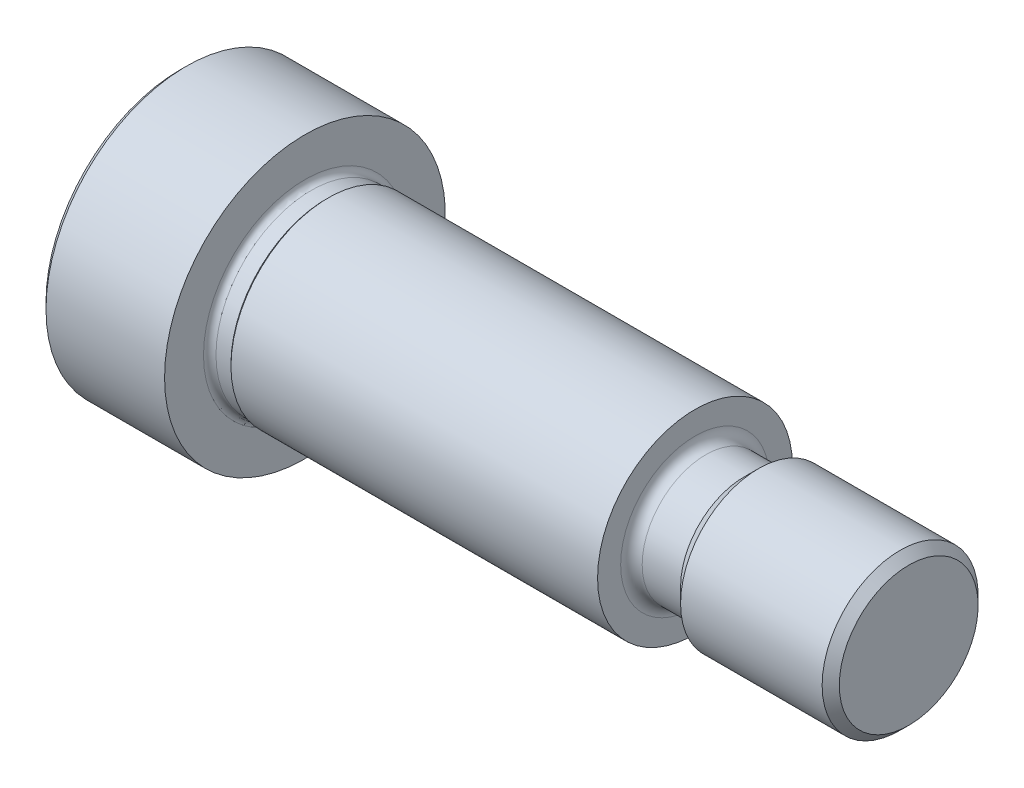
ISO-10303-21;
HEADER;
FILE_DESCRIPTION(('STEP AP214'),'2;1');
FILE_NAME('part.step','',(''),(''),'','','');
FILE_SCHEMA(('AUTOMOTIVE_DESIGN { 1 0 10303 214 1 1 1 1 }'));
ENDSEC;
DATA;
#1=APPLICATION_CONTEXT('core data for automotive mechanical design processes');
#2=APPLICATION_PROTOCOL_DEFINITION('international standard','automotive_design',2000,#1);
#3=PRODUCT_CONTEXT('',#1,'mechanical');
#4=PRODUCT('Part','Part','',(#3));
#5=PRODUCT_RELATED_PRODUCT_CATEGORY('part','',(#4));
#6=PRODUCT_DEFINITION_FORMATION('','',#4);
#7=PRODUCT_DEFINITION_CONTEXT('part definition',#1,'design');
#8=PRODUCT_DEFINITION('design','',#6,#7);
#9=PRODUCT_DEFINITION_SHAPE('','',#8);
#10=(LENGTH_UNIT() NAMED_UNIT(*) SI_UNIT(.MILLI.,.METRE.));
#11=(NAMED_UNIT(*) PLANE_ANGLE_UNIT() SI_UNIT($,.RADIAN.));
#12=(NAMED_UNIT(*) SI_UNIT($,.STERADIAN.) SOLID_ANGLE_UNIT());
#13=UNCERTAINTY_MEASURE_WITH_UNIT(LENGTH_MEASURE(1.E-05),#10,'distance_accuracy_value','');
#14=(GEOMETRIC_REPRESENTATION_CONTEXT(3) GLOBAL_UNCERTAINTY_ASSIGNED_CONTEXT((#13)) GLOBAL_UNIT_ASSIGNED_CONTEXT((#10,
#11,#12)) REPRESENTATION_CONTEXT('',''));
#15=CARTESIAN_POINT('',(0.,0.,0.));
#16=DIRECTION('',(0.,0.,1.));
#17=DIRECTION('',(1.,0.,0.));
#18=AXIS2_PLACEMENT_3D('',#15,#16,#17);
#19=CARTESIAN_POINT('',(0.,0.,0.));
#20=DIRECTION('',(-1.,0.,0.));
#21=DIRECTION('',(0.,0.,1.));
#22=AXIS2_PLACEMENT_3D('',#19,#20,#21);
#23=PLANE('',#22);
#24=CARTESIAN_POINT('',(0.,0.,0.));
#25=DIRECTION('',(-1.,0.,0.));
#26=DIRECTION('',(0.,0.,1.));
#27=AXIS2_PLACEMENT_3D('',#24,#25,#26);
#28=CIRCLE('',#27,17.2);
#29=CARTESIAN_POINT('',(0.,0.,17.2));
#30=VERTEX_POINT('',#29);
#31=EDGE_CURVE('E42',#30,#30,#28,.T.);
#32=ORIENTED_EDGE('',*,*,#31,.T.);
#33=EDGE_LOOP('',(#32));
#34=FACE_BOUND('',#33,.T.);
#35=DIRECTION('',(0.,-0.5,-0.866025403784439));
#36=VECTOR('',#35,1.);
#37=CARTESIAN_POINT('',(0.,-3.46410161513776,6.));
#38=LINE('',#37,#36);
#39=CARTESIAN_POINT('',(0.,-3.46410161513776,6.));
#40=VERTEX_POINT('',#39);
#41=CARTESIAN_POINT('',(0.,-6.92820323027552,0.));
#42=VERTEX_POINT('',#41);
#43=EDGE_CURVE('E49',#40,#42,#38,.T.);
#44=ORIENTED_EDGE('',*,*,#43,.T.);
#45=DIRECTION('',(0.,0.5,-0.866025403784438));
#46=VECTOR('',#45,1.);
#47=CARTESIAN_POINT('',(0.,-6.92820323027552,0.));
#48=LINE('',#47,#46);
#49=CARTESIAN_POINT('',(0.,-3.46410161513776,-6.));
#50=VERTEX_POINT('',#49);
#51=EDGE_CURVE('E324',#42,#50,#48,.T.);
#52=ORIENTED_EDGE('',*,*,#51,.T.);
#53=DIRECTION('',(0.,1.,0.));
#54=VECTOR('',#53,1.);
#55=CARTESIAN_POINT('',(0.,-3.46410161513776,-6.));
#56=LINE('',#55,#54);
#57=CARTESIAN_POINT('',(0.,3.46410161513775,-6.));
#58=VERTEX_POINT('',#57);
#59=EDGE_CURVE('E129',#50,#58,#56,.T.);
#60=ORIENTED_EDGE('',*,*,#59,.T.);
#61=DIRECTION('',(0.,0.500000000000001,0.866025403784438));
#62=VECTOR('',#61,1.);
#63=CARTESIAN_POINT('',(0.,3.46410161513775,-6.));
#64=LINE('',#63,#62);
#65=CARTESIAN_POINT('',(0.,6.92820323027551,0.));
#66=VERTEX_POINT('',#65);
#67=EDGE_CURVE('E327',#58,#66,#64,.T.);
#68=ORIENTED_EDGE('',*,*,#67,.T.);
#69=DIRECTION('',(0.,-0.500000000000001,0.866025403784438));
#70=VECTOR('',#69,1.);
#71=CARTESIAN_POINT('',(0.,6.92820323027551,0.));
#72=LINE('',#71,#70);
#73=CARTESIAN_POINT('',(0.,3.46410161513775,6.));
#74=VERTEX_POINT('',#73);
#75=EDGE_CURVE('E329',#66,#74,#72,.T.);
#76=ORIENTED_EDGE('',*,*,#75,.T.);
#77=DIRECTION('',(0.,-1.,0.));
#78=VECTOR('',#77,1.);
#79=CARTESIAN_POINT('',(0.,3.46410161513775,6.));
#80=LINE('',#79,#78);
#81=EDGE_CURVE('E331',#74,#40,#80,.T.);
#82=ORIENTED_EDGE('',*,*,#81,.T.);
#83=EDGE_LOOP('',(#44,#52,#60,#68,#76,#82));
#84=FACE_BOUND('',#83,.T.);
#85=ADVANCED_FACE('F34',(#34,#84),#23,.T.);
#86=CARTESIAN_POINT('',(-6.34999999999999,0.,0.));
#87=DIRECTION('',(-1.,0.,0.));
#88=DIRECTION('',(0.,0.,1.));
#89=AXIS2_PLACEMENT_3D('',#86,#87,#88);
#90=CYLINDRICAL_SURFACE('',#89,18.);
#91=CARTESIAN_POINT('',(0.800000000000006,0.,0.));
#92=DIRECTION('',(-1.,0.,0.));
#93=DIRECTION('',(0.,0.,1.));
#94=AXIS2_PLACEMENT_3D('',#91,#92,#93);
#95=CIRCLE('',#94,18.);
#96=CARTESIAN_POINT('',(0.800000000000006,0.,18.));
#97=VERTEX_POINT('',#96);
#98=EDGE_CURVE('E11',#97,#97,#95,.F.);
#99=ORIENTED_EDGE('',*,*,#98,.T.);
#100=EDGE_LOOP('',(#99));
#101=FACE_BOUND('',#100,.T.);
#102=CARTESIAN_POINT('',(16.,0.,0.));
#103=DIRECTION('',(-1.,0.,0.));
#104=DIRECTION('',(0.,0.,1.));
#105=AXIS2_PLACEMENT_3D('',#102,#103,#104);
#106=CIRCLE('',#105,18.);
#107=CARTESIAN_POINT('',(16.,0.,18.));
#108=VERTEX_POINT('',#107);
#109=EDGE_CURVE('E176',#108,#108,#106,.T.);
#110=ORIENTED_EDGE('',*,*,#109,.T.);
#111=EDGE_LOOP('',(#110));
#112=FACE_BOUND('',#111,.T.);
#113=ADVANCED_FACE('F195',(#101,#112),#90,.T.);
#114=CARTESIAN_POINT('',(16.,18.,0.));
#115=DIRECTION('',(1.,0.,0.));
#116=DIRECTION('',(0.,0.,-1.));
#117=AXIS2_PLACEMENT_3D('',#114,#115,#116);
#118=PLANE('',#117);
#119=CARTESIAN_POINT('',(16.,0.,0.));
#120=DIRECTION('',(-1.,0.,0.));
#121=DIRECTION('',(0.,0.,1.));
#122=AXIS2_PLACEMENT_3D('',#119,#120,#121);
#123=CIRCLE('',#122,13.01);
#124=CARTESIAN_POINT('',(16.,0.,13.01));
#125=VERTEX_POINT('',#124);
#126=EDGE_CURVE('E173',#125,#125,#123,.T.);
#127=ORIENTED_EDGE('',*,*,#126,.T.);
#128=EDGE_LOOP('',(#127));
#129=FACE_BOUND('',#128,.T.);
#130=ORIENTED_EDGE('',*,*,#109,.F.);
#131=EDGE_LOOP('',(#130));
#132=FACE_BOUND('',#131,.T.);
#133=ADVANCED_FACE('F199',(#129,#132),#118,.T.);
#134=CARTESIAN_POINT('',(16.8,0.,0.));
#135=DIRECTION('',(-1.,0.,0.));
#136=DIRECTION('',(0.,0.,1.));
#137=AXIS2_PLACEMENT_3D('',#134,#135,#136);
#138=TOROIDAL_SURFACE('',#137,13.01,0.800000000000002);
#139=ORIENTED_EDGE('',*,*,#126,.F.);
#140=EDGE_LOOP('',(#139));
#141=FACE_BOUND('',#140,.T.);
#142=CARTESIAN_POINT('',(16.8,0.,0.));
#143=DIRECTION('',(-1.,0.,0.));
#144=DIRECTION('',(0.,0.,1.));
#145=AXIS2_PLACEMENT_3D('',#142,#143,#144);
#146=CIRCLE('',#145,12.21);
#147=CARTESIAN_POINT('',(16.8,0.,12.21));
#148=VERTEX_POINT('',#147);
#149=EDGE_CURVE('E170',#148,#148,#146,.T.);
#150=ORIENTED_EDGE('',*,*,#149,.T.);
#151=EDGE_LOOP('',(#150));
#152=FACE_BOUND('',#151,.T.);
#153=ADVANCED_FACE('F205',(#141,#152),#138,.F.);
#154=CARTESIAN_POINT('',(-6.34999999999999,0.,0.));
#155=DIRECTION('',(-1.,0.,0.));
#156=DIRECTION('',(0.,0.,1.));
#157=AXIS2_PLACEMENT_3D('',#154,#155,#156);
#158=CYLINDRICAL_SURFACE('',#157,12.21);
#159=CARTESIAN_POINT('',(18.72,0.,0.));
#160=DIRECTION('',(-1.,0.,0.));
#161=DIRECTION('',(0.,0.,1.));
#162=AXIS2_PLACEMENT_3D('',#159,#160,#161);
#163=CIRCLE('',#162,12.21);
#164=CARTESIAN_POINT('',(18.72,0.,12.21));
#165=VERTEX_POINT('',#164);
#166=EDGE_CURVE('E167',#165,#165,#163,.T.);
#167=ORIENTED_EDGE('',*,*,#166,.T.);
#168=EDGE_LOOP('',(#167));
#169=FACE_BOUND('',#168,.T.);
#170=ORIENTED_EDGE('',*,*,#149,.F.);
#171=EDGE_LOOP('',(#170));
#172=FACE_BOUND('',#171,.T.);
#173=ADVANCED_FACE('F209',(#169,#172),#158,.T.);
#174=CARTESIAN_POINT('',(18.72,0.,0.));
#175=DIRECTION('',(1.,0.,0.));
#176=DIRECTION('',(0.,0.,-1.));
#177=AXIS2_PLACEMENT_3D('',#174,#175,#176);
#178=CONICAL_SURFACE('',#177,12.21,0.785398163397448);
#179=CARTESIAN_POINT('',(19.,0.,0.));
#180=DIRECTION('',(-1.,0.,0.));
#181=DIRECTION('',(0.,0.,1.));
#182=AXIS2_PLACEMENT_3D('',#179,#180,#181);
#183=CIRCLE('',#182,12.49);
#184=CARTESIAN_POINT('',(19.,0.,12.49));
#185=VERTEX_POINT('',#184);
#186=EDGE_CURVE('E164',#185,#185,#183,.T.);
#187=ORIENTED_EDGE('',*,*,#186,.T.);
#188=EDGE_LOOP('',(#187));
#189=FACE_BOUND('',#188,.T.);
#190=ORIENTED_EDGE('',*,*,#166,.F.);
#191=EDGE_LOOP('',(#190));
#192=FACE_BOUND('',#191,.T.);
#193=ADVANCED_FACE('F213',(#189,#192),#178,.T.);
#194=CARTESIAN_POINT('',(-6.34999999999999,0.,0.));
#195=DIRECTION('',(-1.,0.,0.));
#196=DIRECTION('',(0.,0.,1.));
#197=AXIS2_PLACEMENT_3D('',#194,#195,#196);
#198=CYLINDRICAL_SURFACE('',#197,12.49);
#199=CARTESIAN_POINT('',(66.,0.,0.));
#200=DIRECTION('',(-1.,0.,0.));
#201=DIRECTION('',(0.,0.,1.));
#202=AXIS2_PLACEMENT_3D('',#199,#200,#201);
#203=CIRCLE('',#202,12.49);
#204=CARTESIAN_POINT('',(66.,0.,12.49));
#205=VERTEX_POINT('',#204);
#206=EDGE_CURVE('E161',#205,#205,#203,.T.);
#207=ORIENTED_EDGE('',*,*,#206,.T.);
#208=EDGE_LOOP('',(#207));
#209=FACE_BOUND('',#208,.T.);
#210=ORIENTED_EDGE('',*,*,#186,.F.);
#211=EDGE_LOOP('',(#210));
#212=FACE_BOUND('',#211,.T.);
#213=ADVANCED_FACE('F217',(#209,#212),#198,.T.);
#214=CARTESIAN_POINT('',(66.,12.49,0.));
#215=DIRECTION('',(1.,0.,0.));
#216=DIRECTION('',(0.,0.,-1.));
#217=AXIS2_PLACEMENT_3D('',#214,#215,#216);
#218=PLANE('',#217);
#219=CARTESIAN_POINT('',(66.,0.,0.));
#220=DIRECTION('',(-1.,0.,0.));
#221=DIRECTION('',(0.,0.,1.));
#222=AXIS2_PLACEMENT_3D('',#219,#220,#221);
#223=CIRCLE('',#222,9.53);
#224=CARTESIAN_POINT('',(66.,0.,9.53));
#225=VERTEX_POINT('',#224);
#226=EDGE_CURVE('E158',#225,#225,#223,.T.);
#227=ORIENTED_EDGE('',*,*,#226,.T.);
#228=EDGE_LOOP('',(#227));
#229=FACE_BOUND('',#228,.T.);
#230=ORIENTED_EDGE('',*,*,#206,.F.);
#231=EDGE_LOOP('',(#230));
#232=FACE_BOUND('',#231,.T.);
#233=ADVANCED_FACE('F221',(#229,#232),#218,.T.);
#234=CARTESIAN_POINT('',(67.38,0.,0.));
#235=DIRECTION('',(-1.,0.,0.));
#236=DIRECTION('',(0.,0.,1.));
#237=AXIS2_PLACEMENT_3D('',#234,#235,#236);
#238=TOROIDAL_SURFACE('',#237,9.53,1.37999999999999);
#239=CARTESIAN_POINT('',(67.38,0.,0.));
#240=DIRECTION('',(-1.,0.,0.));
#241=DIRECTION('',(0.,0.,1.));
#242=AXIS2_PLACEMENT_3D('',#239,#240,#241);
#243=CIRCLE('',#242,8.15000000000001);
#244=CARTESIAN_POINT('',(67.38,0.,8.15000000000001));
#245=VERTEX_POINT('',#244);
#246=EDGE_CURVE('E155',#245,#245,#243,.T.);
#247=ORIENTED_EDGE('',*,*,#246,.T.);
#248=EDGE_LOOP('',(#247));
#249=FACE_BOUND('',#248,.T.);
#250=ORIENTED_EDGE('',*,*,#226,.F.);
#251=EDGE_LOOP('',(#250));
#252=FACE_BOUND('',#251,.T.);
#253=ADVANCED_FACE('F225',(#249,#252),#238,.F.);
#254=CARTESIAN_POINT('',(-6.34999999999999,0.,0.));
#255=DIRECTION('',(-1.,0.,0.));
#256=DIRECTION('',(0.,0.,1.));
#257=AXIS2_PLACEMENT_3D('',#254,#255,#256);
#258=CYLINDRICAL_SURFACE('',#257,8.15000000000001);
#259=CARTESIAN_POINT('',(72.3,0.,0.));
#260=DIRECTION('',(-1.,0.,0.));
#261=DIRECTION('',(0.,0.,1.));
#262=AXIS2_PLACEMENT_3D('',#259,#260,#261);
#263=CIRCLE('',#262,8.15);
#264=CARTESIAN_POINT('',(72.3,0.,8.15));
#265=VERTEX_POINT('',#264);
#266=EDGE_CURVE('E152',#265,#265,#263,.T.);
#267=ORIENTED_EDGE('',*,*,#266,.T.);
#268=EDGE_LOOP('',(#267));
#269=FACE_BOUND('',#268,.T.);
#270=ORIENTED_EDGE('',*,*,#246,.F.);
#271=EDGE_LOOP('',(#270));
#272=FACE_BOUND('',#271,.T.);
#273=ADVANCED_FACE('F229',(#269,#272),#258,.T.);
#274=CARTESIAN_POINT('',(72.3,0.,0.));
#275=DIRECTION('',(1.,0.,0.));
#276=DIRECTION('',(0.,0.,-1.));
#277=AXIS2_PLACEMENT_3D('',#274,#275,#276);
#278=CONICAL_SURFACE('',#277,8.15,0.785398163397447);
#279=CARTESIAN_POINT('',(74.15,0.,0.));
#280=DIRECTION('',(-1.,0.,0.));
#281=DIRECTION('',(0.,0.,1.));
#282=AXIS2_PLACEMENT_3D('',#279,#280,#281);
#283=CIRCLE('',#282,10.);
#284=CARTESIAN_POINT('',(74.15,0.,10.));
#285=VERTEX_POINT('',#284);
#286=EDGE_CURVE('E149',#285,#285,#283,.T.);
#287=ORIENTED_EDGE('',*,*,#286,.T.);
#288=EDGE_LOOP('',(#287));
#289=FACE_BOUND('',#288,.T.);
#290=ORIENTED_EDGE('',*,*,#266,.F.);
#291=EDGE_LOOP('',(#290));
#292=FACE_BOUND('',#291,.T.);
#293=ADVANCED_FACE('F233',(#289,#292),#278,.T.);
#294=CARTESIAN_POINT('',(-6.34999999999999,0.,0.));
#295=DIRECTION('',(-1.,0.,0.));
#296=DIRECTION('',(0.,0.,1.));
#297=AXIS2_PLACEMENT_3D('',#294,#295,#296);
#298=CYLINDRICAL_SURFACE('',#297,10.);
#299=CARTESIAN_POINT('',(92.2984999999999,0.,0.));
#300=DIRECTION('',(-1.,0.,0.));
#301=DIRECTION('',(0.,0.,1.));
#302=AXIS2_PLACEMENT_3D('',#299,#300,#301);
#303=CIRCLE('',#302,10.);
#304=CARTESIAN_POINT('',(92.2984999999999,0.,10.));
#305=VERTEX_POINT('',#304);
#306=EDGE_CURVE('E146',#305,#305,#303,.T.);
#307=ORIENTED_EDGE('',*,*,#306,.T.);
#308=EDGE_LOOP('',(#307));
#309=FACE_BOUND('',#308,.T.);
#310=ORIENTED_EDGE('',*,*,#286,.F.);
#311=EDGE_LOOP('',(#310));
#312=FACE_BOUND('',#311,.T.);
#313=ADVANCED_FACE('F237',(#309,#312),#298,.T.);
#314=CARTESIAN_POINT('',(92.2984999999999,0.,0.));
#315=DIRECTION('',(-1.,0.,0.));
#316=DIRECTION('',(0.,0.,1.));
#317=AXIS2_PLACEMENT_3D('',#314,#315,#316);
#318=CONICAL_SURFACE('',#317,10.,0.785398163397427);
#319=CARTESIAN_POINT('',(93.4,0.,0.));
#320=DIRECTION('',(-1.,0.,0.));
#321=DIRECTION('',(0.,0.,1.));
#322=AXIS2_PLACEMENT_3D('',#319,#320,#321);
#323=CIRCLE('',#322,8.8985);
#324=CARTESIAN_POINT('',(93.4,0.,8.8985));
#325=VERTEX_POINT('',#324);
#326=EDGE_CURVE('E142',#325,#325,#323,.T.);
#327=ORIENTED_EDGE('',*,*,#326,.T.);
#328=EDGE_LOOP('',(#327));
#329=FACE_BOUND('',#328,.T.);
#330=ORIENTED_EDGE('',*,*,#306,.F.);
#331=EDGE_LOOP('',(#330));
#332=FACE_BOUND('',#331,.T.);
#333=ADVANCED_FACE('F190',(#329,#332),#318,.T.);
#334=CARTESIAN_POINT('',(93.4,8.8985,0.));
#335=DIRECTION('',(1.,0.,0.));
#336=DIRECTION('',(0.,0.,-1.));
#337=AXIS2_PLACEMENT_3D('',#334,#335,#336);
#338=PLANE('',#337);
#339=ORIENTED_EDGE('',*,*,#326,.F.);
#340=EDGE_LOOP('',(#339));
#341=FACE_BOUND('',#340,.T.);
#342=ADVANCED_FACE('F183',(#341),#338,.T.);
#343=CARTESIAN_POINT('',(0.,0.,0.));
#344=DIRECTION('',(1.,0.,0.));
#345=DIRECTION('',(0.,0.,-1.));
#346=AXIS2_PLACEMENT_3D('',#343,#344,#345);
#347=CONICAL_SURFACE('',#346,17.2,0.785398163397444);
#348=ORIENTED_EDGE('',*,*,#98,.F.);
#349=EDGE_LOOP('',(#348));
#350=FACE_BOUND('',#349,.T.);
#351=ORIENTED_EDGE('',*,*,#31,.F.);
#352=EDGE_LOOP('',(#351));
#353=FACE_BOUND('',#352,.T.);
#354=ADVANCED_FACE('F36',(#350,#353),#347,.T.);
#355=CARTESIAN_POINT('',(10.,-6.92820323027552,0.));
#356=DIRECTION('',(0.,0.866025403784439,0.5));
#357=DIRECTION('',(0.,-0.5,0.866025403784439));
#358=AXIS2_PLACEMENT_3D('',#355,#356,#357);
#359=PLANE('',#358);
#360=DIRECTION('',(0.,0.5,-0.866025403784438));
#361=VECTOR('',#360,1.);
#362=CARTESIAN_POINT('',(10.,-6.92820323027552,0.));
#363=LINE('',#362,#361);
#364=CARTESIAN_POINT('',(10.,-6.92820323027552,0.));
#365=VERTEX_POINT('',#364);
#366=CARTESIAN_POINT('',(10.,-5.19615242270663,-3.));
#367=VERTEX_POINT('',#366);
#368=EDGE_CURVE('E57',#365,#367,#363,.T.);
#369=ORIENTED_EDGE('',*,*,#368,.T.);
#370=CARTESIAN_POINT('',(10.,-3.46410161513776,-6.));
#371=VERTEX_POINT('',#370);
#372=EDGE_CURVE('E107',#367,#371,#363,.T.);
#373=ORIENTED_EDGE('',*,*,#372,.T.);
#374=DIRECTION('',(-1.,0.,0.));
#375=VECTOR('',#374,1.);
#376=CARTESIAN_POINT('',(10.,-3.46410161513776,-6.));
#377=LINE('',#376,#375);
#378=EDGE_CURVE('E111',#371,#50,#377,.T.);
#379=ORIENTED_EDGE('',*,*,#378,.T.);
#380=ORIENTED_EDGE('',*,*,#51,.F.);
#381=DIRECTION('',(-1.,0.,0.));
#382=VECTOR('',#381,1.);
#383=CARTESIAN_POINT('',(10.,-6.92820323027552,0.));
#384=LINE('',#383,#382);
#385=EDGE_CURVE('E323',#365,#42,#384,.T.);
#386=ORIENTED_EDGE('',*,*,#385,.F.);
#387=EDGE_LOOP('',(#369,#373,#379,#380,#386));
#388=FACE_BOUND('',#387,.T.);
#389=ADVANCED_FACE('F109',(#388),#359,.T.);
#390=CARTESIAN_POINT('',(10.,-3.46410161513776,-6.));
#391=DIRECTION('',(0.,0.,1.));
#392=DIRECTION('',(0.,-1.,0.));
#393=AXIS2_PLACEMENT_3D('',#390,#391,#392);
#394=PLANE('',#393);
#395=DIRECTION('',(0.,1.,0.));
#396=VECTOR('',#395,1.);
#397=CARTESIAN_POINT('',(10.,-3.46410161513776,-6.));
#398=LINE('',#397,#396);
#399=CARTESIAN_POINT('',(10.,0.,-6.));
#400=VERTEX_POINT('',#399);
#401=EDGE_CURVE('E116',#371,#400,#398,.T.);
#402=ORIENTED_EDGE('',*,*,#401,.T.);
#403=CARTESIAN_POINT('',(10.,3.46410161513775,-6.));
#404=VERTEX_POINT('',#403);
#405=EDGE_CURVE('E124',#400,#404,#398,.T.);
#406=ORIENTED_EDGE('',*,*,#405,.T.);
#407=DIRECTION('',(-1.,0.,0.));
#408=VECTOR('',#407,1.);
#409=CARTESIAN_POINT('',(10.,3.46410161513775,-6.));
#410=LINE('',#409,#408);
#411=EDGE_CURVE('E131',#404,#58,#410,.T.);
#412=ORIENTED_EDGE('',*,*,#411,.T.);
#413=ORIENTED_EDGE('',*,*,#59,.F.);
#414=ORIENTED_EDGE('',*,*,#378,.F.);
#415=EDGE_LOOP('',(#402,#406,#412,#413,#414));
#416=FACE_BOUND('',#415,.T.);
#417=ADVANCED_FACE('F127',(#416),#394,.T.);
#418=CARTESIAN_POINT('',(10.,3.46410161513775,-6.));
#419=DIRECTION('',(0.,-0.866025403784438,0.500000000000001));
#420=DIRECTION('',(0.,-0.500000000000001,-0.866025403784438));
#421=AXIS2_PLACEMENT_3D('',#418,#419,#420);
#422=PLANE('',#421);
#423=DIRECTION('',(0.,0.500000000000001,0.866025403784438));
#424=VECTOR('',#423,1.);
#425=CARTESIAN_POINT('',(10.,3.46410161513775,-6.));
#426=LINE('',#425,#424);
#427=CARTESIAN_POINT('',(10.,5.19615242270663,-3.00000000000001));
#428=VERTEX_POINT('',#427);
#429=EDGE_CURVE('E287',#404,#428,#426,.T.);
#430=ORIENTED_EDGE('',*,*,#429,.T.);
#431=CARTESIAN_POINT('',(10.,6.92820323027551,0.));
#432=VERTEX_POINT('',#431);
#433=EDGE_CURVE('E123',#428,#432,#426,.T.);
#434=ORIENTED_EDGE('',*,*,#433,.T.);
#435=DIRECTION('',(-1.,0.,0.));
#436=VECTOR('',#435,1.);
#437=CARTESIAN_POINT('',(10.,6.92820323027551,0.));
#438=LINE('',#437,#436);
#439=EDGE_CURVE('E137',#432,#66,#438,.T.);
#440=ORIENTED_EDGE('',*,*,#439,.T.);
#441=ORIENTED_EDGE('',*,*,#67,.F.);
#442=ORIENTED_EDGE('',*,*,#411,.F.);
#443=EDGE_LOOP('',(#430,#434,#440,#441,#442));
#444=FACE_BOUND('',#443,.T.);
#445=ADVANCED_FACE('F251',(#444),#422,.T.);
#446=CARTESIAN_POINT('',(10.,6.92820323027551,0.));
#447=DIRECTION('',(0.,-0.866025403784438,-0.500000000000001));
#448=DIRECTION('',(0.,0.500000000000001,-0.866025403784438));
#449=AXIS2_PLACEMENT_3D('',#446,#447,#448);
#450=PLANE('',#449);
#451=DIRECTION('',(0.,-0.500000000000001,0.866025403784438));
#452=VECTOR('',#451,1.);
#453=CARTESIAN_POINT('',(10.,6.92820323027551,0.));
#454=LINE('',#453,#452);
#455=CARTESIAN_POINT('',(10.,5.19615242270663,3.00000000000001));
#456=VERTEX_POINT('',#455);
#457=EDGE_CURVE('E292',#432,#456,#454,.T.);
#458=ORIENTED_EDGE('',*,*,#457,.T.);
#459=CARTESIAN_POINT('',(10.,3.46410161513775,6.));
#460=VERTEX_POINT('',#459);
#461=EDGE_CURVE('E298',#456,#460,#454,.T.);
#462=ORIENTED_EDGE('',*,*,#461,.T.);
#463=DIRECTION('',(-1.,0.,0.));
#464=VECTOR('',#463,1.);
#465=CARTESIAN_POINT('',(10.,3.46410161513775,6.));
#466=LINE('',#465,#464);
#467=EDGE_CURVE('E318',#460,#74,#466,.T.);
#468=ORIENTED_EDGE('',*,*,#467,.T.);
#469=ORIENTED_EDGE('',*,*,#75,.F.);
#470=ORIENTED_EDGE('',*,*,#439,.F.);
#471=EDGE_LOOP('',(#458,#462,#468,#469,#470));
#472=FACE_BOUND('',#471,.T.);
#473=ADVANCED_FACE('F254',(#472),#450,.T.);
#474=CARTESIAN_POINT('',(10.,3.46410161513775,6.));
#475=DIRECTION('',(0.,0.,-1.));
#476=DIRECTION('',(-1.,0.,0.));
#477=AXIS2_PLACEMENT_3D('',#474,#475,#476);
#478=PLANE('',#477);
#479=DIRECTION('',(0.,-1.,0.));
#480=VECTOR('',#479,1.);
#481=CARTESIAN_POINT('',(10.,3.46410161513775,6.));
#482=LINE('',#481,#480);
#483=CARTESIAN_POINT('',(10.,0.,6.));
#484=VERTEX_POINT('',#483);
#485=EDGE_CURVE('E305',#460,#484,#482,.T.);
#486=ORIENTED_EDGE('',*,*,#485,.T.);
#487=CARTESIAN_POINT('',(10.,-3.46410161513776,6.));
#488=VERTEX_POINT('',#487);
#489=EDGE_CURVE('E308',#484,#488,#482,.T.);
#490=ORIENTED_EDGE('',*,*,#489,.T.);
#491=DIRECTION('',(-1.,0.,0.));
#492=VECTOR('',#491,1.);
#493=CARTESIAN_POINT('',(10.,-3.46410161513776,6.));
#494=LINE('',#493,#492);
#495=EDGE_CURVE('E336',#488,#40,#494,.T.);
#496=ORIENTED_EDGE('',*,*,#495,.T.);
#497=ORIENTED_EDGE('',*,*,#81,.F.);
#498=ORIENTED_EDGE('',*,*,#467,.F.);
#499=EDGE_LOOP('',(#486,#490,#496,#497,#498));
#500=FACE_BOUND('',#499,.T.);
#501=ADVANCED_FACE('F258',(#500),#478,.T.);
#502=CARTESIAN_POINT('',(10.,-3.46410161513776,6.));
#503=DIRECTION('',(0.,0.866025403784439,-0.5));
#504=DIRECTION('',(0.,0.5,0.866025403784439));
#505=AXIS2_PLACEMENT_3D('',#502,#503,#504);
#506=PLANE('',#505);
#507=DIRECTION('',(0.,-0.5,-0.866025403784439));
#508=VECTOR('',#507,1.);
#509=CARTESIAN_POINT('',(10.,-3.46410161513776,6.));
#510=LINE('',#509,#508);
#511=CARTESIAN_POINT('',(10.,-5.19615242270664,3.));
#512=VERTEX_POINT('',#511);
#513=EDGE_CURVE('E311',#488,#512,#510,.T.);
#514=ORIENTED_EDGE('',*,*,#513,.T.);
#515=EDGE_CURVE('E319',#512,#365,#510,.T.);
#516=ORIENTED_EDGE('',*,*,#515,.T.);
#517=ORIENTED_EDGE('',*,*,#385,.T.);
#518=ORIENTED_EDGE('',*,*,#43,.F.);
#519=ORIENTED_EDGE('',*,*,#495,.F.);
#520=EDGE_LOOP('',(#514,#516,#517,#518,#519));
#521=FACE_BOUND('',#520,.T.);
#522=ADVANCED_FACE('F262',(#521),#506,.T.);
#523=CARTESIAN_POINT('',(10.,0.,-12.));
#524=DIRECTION('',(1.,0.,0.));
#525=DIRECTION('',(0.,0.,-1.));
#526=AXIS2_PLACEMENT_3D('',#523,#524,#525);
#527=PLANE('',#526);
#528=CARTESIAN_POINT('',(10.,0.,0.));
#529=DIRECTION('',(-1.,0.,0.));
#530=DIRECTION('',(0.,0.,1.));
#531=AXIS2_PLACEMENT_3D('',#528,#529,#530);
#532=CIRCLE('',#531,6.);
#533=EDGE_CURVE('E284',#428,#400,#532,.T.);
#534=ORIENTED_EDGE('',*,*,#533,.F.);
#535=ORIENTED_EDGE('',*,*,#429,.F.);
#536=ORIENTED_EDGE('',*,*,#405,.F.);
#537=EDGE_LOOP('',(#534,#535,#536));
#538=FACE_BOUND('',#537,.T.);
#539=ADVANCED_FACE('F266',(#538),#527,.F.);
#540=EDGE_CURVE('E143',#456,#428,#532,.T.);
#541=ORIENTED_EDGE('',*,*,#540,.F.);
#542=ORIENTED_EDGE('',*,*,#457,.F.);
#543=ORIENTED_EDGE('',*,*,#433,.F.);
#544=EDGE_LOOP('',(#541,#542,#543));
#545=FACE_BOUND('',#544,.T.);
#546=ADVANCED_FACE('F276',(#545),#527,.F.);
#547=EDGE_CURVE('E136',#484,#456,#532,.T.);
#548=ORIENTED_EDGE('',*,*,#547,.F.);
#549=ORIENTED_EDGE('',*,*,#485,.F.);
#550=ORIENTED_EDGE('',*,*,#461,.F.);
#551=EDGE_LOOP('',(#548,#549,#550));
#552=FACE_BOUND('',#551,.T.);
#553=ADVANCED_FACE('F281',(#552),#527,.F.);
#554=EDGE_CURVE('E130',#512,#484,#532,.T.);
#555=ORIENTED_EDGE('',*,*,#554,.F.);
#556=ORIENTED_EDGE('',*,*,#513,.F.);
#557=ORIENTED_EDGE('',*,*,#489,.F.);
#558=EDGE_LOOP('',(#555,#556,#557));
#559=FACE_BOUND('',#558,.T.);
#560=ADVANCED_FACE('F273',(#559),#527,.F.);
#561=EDGE_CURVE('E134',#367,#512,#532,.T.);
#562=ORIENTED_EDGE('',*,*,#561,.F.);
#563=ORIENTED_EDGE('',*,*,#368,.F.);
#564=ORIENTED_EDGE('',*,*,#515,.F.);
#565=EDGE_LOOP('',(#562,#563,#564));
#566=FACE_BOUND('',#565,.T.);
#567=ADVANCED_FACE('F269',(#566),#527,.F.);
#568=EDGE_CURVE('E119',#400,#367,#532,.T.);
#569=ORIENTED_EDGE('',*,*,#568,.F.);
#570=ORIENTED_EDGE('',*,*,#401,.F.);
#571=ORIENTED_EDGE('',*,*,#372,.F.);
#572=EDGE_LOOP('',(#569,#570,#571));
#573=FACE_BOUND('',#572,.T.);
#574=ADVANCED_FACE('F117',(#573),#527,.F.);
#575=CARTESIAN_POINT('',(13.4641016151378,0.,0.));
#576=DIRECTION('',(-1.,0.,0.));
#577=DIRECTION('',(0.,0.,1.));
#578=AXIS2_PLACEMENT_3D('',#575,#576,#577);
#579=CONICAL_SURFACE('',#578,0.,1.04719755119659);
#580=ORIENTED_EDGE('',*,*,#547,.T.);
#581=ORIENTED_EDGE('',*,*,#540,.T.);
#582=ORIENTED_EDGE('',*,*,#533,.T.);
#583=ORIENTED_EDGE('',*,*,#568,.T.);
#584=ORIENTED_EDGE('',*,*,#561,.T.);
#585=ORIENTED_EDGE('',*,*,#554,.T.);
#586=EDGE_LOOP('',(#580,#581,#582,#583,#584,#585));
#587=FACE_BOUND('',#586,.T.);
#588=CARTESIAN_POINT('',(13.4641016151378,0.,0.));
#589=VERTEX_POINT('',#588);
#590=VERTEX_LOOP('',#589);
#591=FACE_BOUND('',#590,.T.);
#592=ADVANCED_FACE('F245',(#587,#591),#579,.F.);
#593=CLOSED_SHELL('',(#85,#113,#133,#153,#173,#193,#213,#233,#253,#273,#293,#313,#333,#342,#354,
#389,#417,#445,#473,#501,#522,#539,#546,#553,#560,#567,#574,#592));
#594=MANIFOLD_SOLID_BREP('B2',#593);
#595=ADVANCED_BREP_SHAPE_REPRESENTATION('',(#18,#594),#14);
#596=SHAPE_DEFINITION_REPRESENTATION(#9,#595);
ENDSEC;
END-ISO-10303-21;
